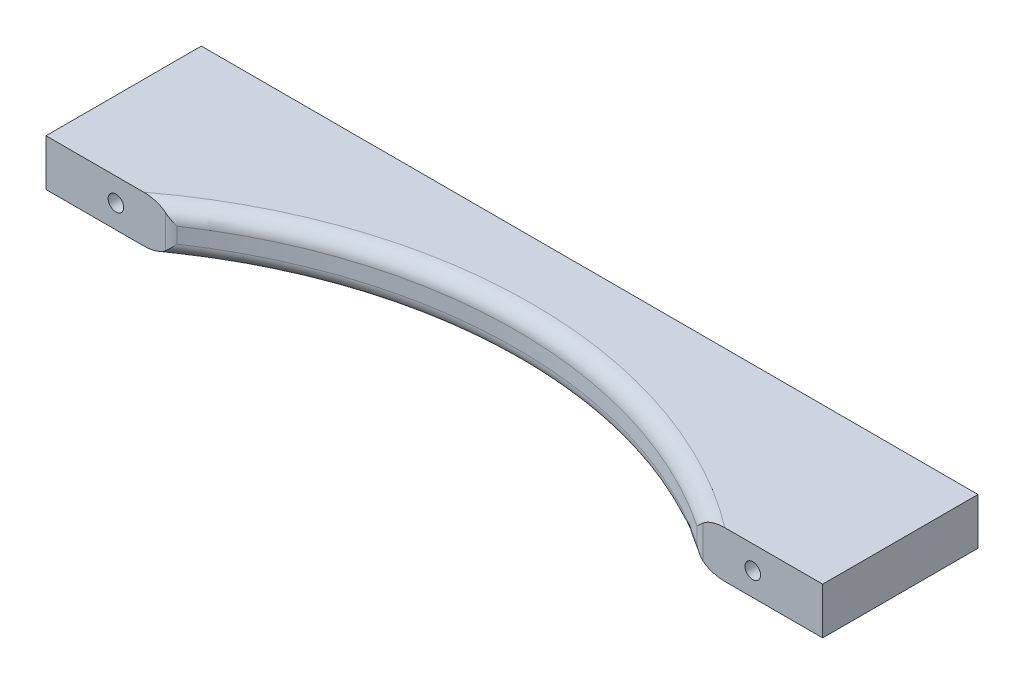
ISO-10303-21;
HEADER;
FILE_DESCRIPTION(('STEP AP214'),'2;1');
FILE_NAME('part.step','',(''),(''),'','','');
FILE_SCHEMA(('AUTOMOTIVE_DESIGN { 1 0 10303 214 1 1 1 1 }'));
ENDSEC;
DATA;
#1=APPLICATION_CONTEXT('core data for automotive mechanical design processes');
#2=APPLICATION_PROTOCOL_DEFINITION('international standard','automotive_design',2000,#1);
#3=PRODUCT_CONTEXT('',#1,'mechanical');
#4=PRODUCT('Part','Part','',(#3));
#5=PRODUCT_RELATED_PRODUCT_CATEGORY('part','',(#4));
#6=PRODUCT_DEFINITION_FORMATION('','',#4);
#7=PRODUCT_DEFINITION_CONTEXT('part definition',#1,'design');
#8=PRODUCT_DEFINITION('design','',#6,#7);
#9=PRODUCT_DEFINITION_SHAPE('','',#8);
#10=(LENGTH_UNIT() NAMED_UNIT(*) SI_UNIT(.MILLI.,.METRE.));
#11=(NAMED_UNIT(*) PLANE_ANGLE_UNIT() SI_UNIT($,.RADIAN.));
#12=(NAMED_UNIT(*) SI_UNIT($,.STERADIAN.) SOLID_ANGLE_UNIT());
#13=UNCERTAINTY_MEASURE_WITH_UNIT(LENGTH_MEASURE(1.E-05),#10,'distance_accuracy_value','');
#14=(GEOMETRIC_REPRESENTATION_CONTEXT(3) GLOBAL_UNCERTAINTY_ASSIGNED_CONTEXT((#13)) GLOBAL_UNIT_ASSIGNED_CONTEXT((#10,
#11,#12)) REPRESENTATION_CONTEXT('',''));
#15=CARTESIAN_POINT('',(0.,0.,0.));
#16=DIRECTION('',(0.,0.,1.));
#17=DIRECTION('',(1.,0.,0.));
#18=AXIS2_PLACEMENT_3D('',#15,#16,#17);
#19=CARTESIAN_POINT('',(0.,0.,50.));
#20=DIRECTION('',(0.,0.,1.));
#21=DIRECTION('',(1.,0.,0.));
#22=AXIS2_PLACEMENT_3D('',#19,#20,#21);
#23=PLANE('',#22);
#24=DIRECTION('',(0.,1.,0.));
#25=VECTOR('',#24,1.);
#26=CARTESIAN_POINT('',(-109.039466664462,-31.249999999999,50.));
#27=LINE('',#26,#25);
#28=CARTESIAN_POINT('',(-109.039466664462,-44.0795960073652,50.));
#29=VERTEX_POINT('',#28);
#30=CARTESIAN_POINT('',(-109.039466664462,-33.4204039926329,50.));
#31=VERTEX_POINT('',#30);
#32=EDGE_CURVE('E61',#29,#31,#27,.T.);
#33=ORIENTED_EDGE('',*,*,#32,.T.);
#34=CARTESIAN_POINT('',(-109.039466664462,-33.4204039926329,50.));
#35=CARTESIAN_POINT('',(-109.121224439638,-33.3520970625122,50.));
#36=CARTESIAN_POINT('',(-109.204705555054,-33.2859015450738,50.));
#37=CARTESIAN_POINT('',(-109.374678941473,-33.1575612629484,50.));
#38=CARTESIAN_POINT('',(-109.461170041312,-33.0954149491876,50.));
#39=CARTESIAN_POINT('',(-109.724217485949,-32.9149794506193,50.));
#40=CARTESIAN_POINT('',(-109.904709502907,-32.8023963965578,50.));
#41=CARTESIAN_POINT('',(-110.272758878631,-32.5917061509023,50.));
#42=CARTESIAN_POINT('',(-110.460280000726,-32.4935348806494,50.));
#43=CARTESIAN_POINT('',(-110.841563246896,-32.3098756932209,50.));
#44=CARTESIAN_POINT('',(-111.035329891093,-32.2243972250962,50.));
#45=CARTESIAN_POINT('',(-111.546071512932,-32.0172719708917,50.));
#46=CARTESIAN_POINT('',(-111.866837557253,-31.9049256579682,50.));
#47=CARTESIAN_POINT('',(-112.516777365589,-31.7079959104703,50.));
#48=CARTESIAN_POINT('',(-112.845954432423,-31.6234235684507,50.));
#49=CARTESIAN_POINT('',(-113.510760899458,-31.4801933058538,50.));
#50=CARTESIAN_POINT('',(-113.846404951294,-31.4216038957608,50.));
#51=CARTESIAN_POINT('',(-114.520965682404,-31.3297585733566,50.));
#52=CARTESIAN_POINT('',(-114.859880429907,-31.2964885353288,50.));
#53=CARTESIAN_POINT('',(-115.339873066364,-31.2671570009662,50.));
#54=CARTESIAN_POINT('',(-115.480379741739,-31.2607171968633,50.));
#55=CARTESIAN_POINT('',(-115.761064979609,-31.2521469067584,50.));
#56=CARTESIAN_POINT('',(-115.901243114649,-31.2500024128778,50.));
#57=CARTESIAN_POINT('',(-116.041434669351,-31.2499999999991,50.));
#58=B_SPLINE_CURVE_WITH_KNOTS('',3,(#34,#35,#36,#37,#38,#39,#40,#41,#42,#43,#44,#45,#46,#47,#48,
#49,#50,#51,#52,#53,#54,#55,#56,#57),.UNSPECIFIED.,.F.,.F.,(4,2,2,2,2,2,2,2,2,2,2,4),(0.,
0.319525794409338,0.638928623632587,1.27633525859326,1.9108158954685,2.54576652335564,
3.56386955724189,4.58237871484075,5.60355768650752,6.62416652235498,7.04607651220801,
7.46660831291451),.UNSPECIFIED.);
#59=CARTESIAN_POINT('',(-116.041434669351,-31.2499999999989,50.));
#60=VERTEX_POINT('',#59);
#61=EDGE_CURVE('E241',#31,#60,#58,.T.);
#62=ORIENTED_EDGE('',*,*,#61,.T.);
#63=DIRECTION('',(-1.,0.,0.));
#64=VECTOR('',#63,1.);
#65=CARTESIAN_POINT('',(102.499999999998,-31.2499999999989,50.));
#66=LINE('',#65,#64);
#67=CARTESIAN_POINT('',(-147.500000000002,-31.2499999999991,50.));
#68=VERTEX_POINT('',#67);
#69=EDGE_CURVE('E149',#60,#68,#66,.T.);
#70=ORIENTED_EDGE('',*,*,#69,.T.);
#71=DIRECTION('',(0.,-1.,0.));
#72=VECTOR('',#71,1.);
#73=CARTESIAN_POINT('',(-147.500000000002,-31.2499999999991,50.));
#74=LINE('',#73,#72);
#75=CARTESIAN_POINT('',(-147.500000000002,-46.249999999999,50.));
#76=VERTEX_POINT('',#75);
#77=EDGE_CURVE('E155',#68,#76,#74,.T.);
#78=ORIENTED_EDGE('',*,*,#77,.T.);
#79=DIRECTION('',(1.,0.,0.));
#80=VECTOR('',#79,1.);
#81=CARTESIAN_POINT('',(-147.500000000002,-46.249999999999,50.));
#82=LINE('',#81,#80);
#83=CARTESIAN_POINT('',(-116.041434669351,-46.249999999999,50.));
#84=VERTEX_POINT('',#83);
#85=EDGE_CURVE('E133',#76,#84,#82,.T.);
#86=ORIENTED_EDGE('',*,*,#85,.T.);
#87=CARTESIAN_POINT('',(-116.041434669351,-46.249999999999,50.));
#88=CARTESIAN_POINT('',(-115.845856817225,-46.2499883262298,50.));
#89=CARTESIAN_POINT('',(-115.65028255459,-46.2458202956799,50.));
#90=CARTESIAN_POINT('',(-115.259472905755,-46.2291877109257,50.));
#91=CARTESIAN_POINT('',(-115.064237545169,-46.2167225548578,50.));
#92=CARTESIAN_POINT('',(-114.674126708154,-46.183483016634,50.));
#93=CARTESIAN_POINT('',(-114.479252449367,-46.1626942113724,50.));
#94=CARTESIAN_POINT('',(-114.090606718168,-46.1127412996749,50.));
#95=CARTESIAN_POINT('',(-113.896835215725,-46.083577422431,50.));
#96=CARTESIAN_POINT('',(-113.331073038017,-45.9856478479633,50.));
#97=CARTESIAN_POINT('',(-112.960967835018,-45.9052792159937,50.));
#98=CARTESIAN_POINT('',(-112.412697516045,-45.7596649519503,50.));
#99=CARTESIAN_POINT('',(-112.231111870841,-45.7069584779846,50.));
#100=CARTESIAN_POINT('',(-111.87070842836,-45.5928106454665,50.));
#101=CARTESIAN_POINT('',(-111.691890286954,-45.5313703827623,50.));
#102=CARTESIAN_POINT('',(-111.294647988112,-45.3832747748802,50.));
#103=CARTESIAN_POINT('',(-111.077149075772,-45.2941192171049,50.));
#104=CARTESIAN_POINT('',(-110.649176467055,-45.100597607759,50.));
#105=CARTESIAN_POINT('',(-110.438696678489,-44.9962451919993,50.));
#106=CARTESIAN_POINT('',(-110.127577316082,-44.8260078182845,50.));
#107=CARTESIAN_POINT('',(-110.02355366556,-44.7662635715145,50.));
#108=CARTESIAN_POINT('',(-109.818277077839,-44.6422044151797,50.));
#109=CARTESIAN_POINT('',(-109.717023737757,-44.577890175169,50.));
#110=CARTESIAN_POINT('',(-109.517466435023,-44.4442732926468,50.));
#111=CARTESIAN_POINT('',(-109.419170885288,-44.3749580346936,50.));
#112=CARTESIAN_POINT('',(-109.226338609784,-44.2311901352725,50.));
#113=CARTESIAN_POINT('',(-109.131803853346,-44.1567348566397,50.));
#114=CARTESIAN_POINT('',(-109.039466664462,-44.0795960073652,50.));
#115=B_SPLINE_CURVE_WITH_KNOTS('',3,(#87,#88,#89,#90,#91,#92,#93,#94,#95,#96,#97,#98,#99,#100,
#101,#102,#103,#104,#105,#106,#107,#108,#109,#110,#111,#112,#113,#114),.UNSPECIFIED.,.F.,.F.,(4,
2,2,2,2,2,2,2,2,2,2,2,2,4),(0.,0.586682938754656,1.17340843943332,1.76115504065223,
2.34888555914224,3.48332263064908,4.05039339803695,4.61739307647509,5.3220594043687,
6.02609730228276,6.38587789583573,6.74560588585582,7.10627538151129,7.46713131942787),.UNSPECIFIED.);
#116=EDGE_CURVE('E66',#84,#29,#115,.T.);
#117=ORIENTED_EDGE('',*,*,#116,.T.);
#118=EDGE_LOOP('',(#33,#62,#70,#78,#86,#117));
#119=FACE_BOUND('',#118,.T.);
#120=CARTESIAN_POINT('',(-125.000000000002,-38.7499999999989,50.));
#121=DIRECTION('',(0.,0.,1.));
#122=DIRECTION('',(1.,0.,0.));
#123=AXIS2_PLACEMENT_3D('',#120,#121,#122);
#124=CIRCLE('',#123,2.50000000001049);
#125=CARTESIAN_POINT('',(-122.499999999992,-38.7499999999989,50.));
#126=VERTEX_POINT('',#125);
#127=EDGE_CURVE('E160',#126,#126,#124,.T.);
#128=ORIENTED_EDGE('',*,*,#127,.F.);
#129=EDGE_LOOP('',(#128));
#130=FACE_BOUND('',#129,.T.);
#131=ADVANCED_FACE('F39',(#119,#130),#23,.T.);
#132=CARTESIAN_POINT('',(102.499999999998,-31.2499999999989,50.));
#133=VERTEX_POINT('',#132);
#134=CARTESIAN_POINT('',(71.0414346693464,-31.2499999999989,50.));
#135=VERTEX_POINT('',#134);
#136=EDGE_CURVE('E151',#133,#135,#66,.T.);
#137=ORIENTED_EDGE('',*,*,#136,.T.);
#138=CARTESIAN_POINT('',(71.0414346693464,-31.2499999999989,50.));
#139=CARTESIAN_POINT('',(70.8458568172207,-31.2500116737681,50.));
#140=CARTESIAN_POINT('',(70.6502825545853,-31.2541797043181,50.));
#141=CARTESIAN_POINT('',(70.2594729057507,-31.2708122890722,50.));
#142=CARTESIAN_POINT('',(70.0642375451653,-31.2832774451401,50.));
#143=CARTESIAN_POINT('',(69.6741267081493,-31.3165169833639,50.));
#144=CARTESIAN_POINT('',(69.4792524493629,-31.3373057886255,50.));
#145=CARTESIAN_POINT('',(69.0906067181636,-31.3872587003231,50.));
#146=CARTESIAN_POINT('',(68.8968352157208,-31.4164225775669,50.));
#147=CARTESIAN_POINT('',(68.3310730380126,-31.5143521520347,50.));
#148=CARTESIAN_POINT('',(67.9609678350139,-31.5947207840042,50.));
#149=CARTESIAN_POINT('',(67.412697516041,-31.7403350480476,50.));
#150=CARTESIAN_POINT('',(67.2311118708366,-31.7930415220133,50.));
#151=CARTESIAN_POINT('',(66.8707084283555,-31.9071893545314,50.));
#152=CARTESIAN_POINT('',(66.6918902869503,-31.9686296172356,50.));
#153=CARTESIAN_POINT('',(66.2946479881079,-32.1167252251177,50.));
#154=CARTESIAN_POINT('',(66.0771490757676,-32.205880782893,50.));
#155=CARTESIAN_POINT('',(65.6491764670506,-32.3994023922389,50.));
#156=CARTESIAN_POINT('',(65.4386966784844,-32.5037548079986,50.));
#157=CARTESIAN_POINT('',(65.1275773160779,-32.6739921817134,50.));
#158=CARTESIAN_POINT('',(65.0235536655558,-32.7337364284834,50.));
#159=CARTESIAN_POINT('',(64.8182770778344,-32.8577955848182,50.));
#160=CARTESIAN_POINT('',(64.7170237377526,-32.922109824829,50.));
#161=CARTESIAN_POINT('',(64.5174664350191,-33.0557267073512,50.));
#162=CARTESIAN_POINT('',(64.4191708852835,-33.1250419653043,50.));
#163=CARTESIAN_POINT('',(64.22633860978,-33.2688098647255,50.));
#164=CARTESIAN_POINT('',(64.1318038533419,-33.3432651433582,50.));
#165=CARTESIAN_POINT('',(64.0394666644578,-33.4204039926327,50.));
#166=B_SPLINE_CURVE_WITH_KNOTS('',3,(#138,#139,#140,#141,#142,#143,#144,#145,#146,#147,#148,
#149,#150,#151,#152,#153,#154,#155,#156,#157,#158,#159,#160,#161,#162,#163,#164,#165),
.UNSPECIFIED.,.F.,.F.,(4,2,2,2,2,2,2,2,2,2,2,2,2,4),(0.,0.586682938754628,1.17340843943328,
1.76115504065217,2.34888555914217,3.48332263064899,4.05039339803683,4.61739307647493,
5.32205940436859,6.02609730228269,6.38587789583572,6.74560588585582,7.10627538151132,
7.46713131942789),.UNSPECIFIED.);
#167=CARTESIAN_POINT('',(64.0394666644578,-33.4204039926327,50.));
#168=VERTEX_POINT('',#167);
#169=EDGE_CURVE('E222',#135,#168,#166,.T.);
#170=ORIENTED_EDGE('',*,*,#169,.T.);
#171=DIRECTION('',(0.,1.,0.));
#172=VECTOR('',#171,1.);
#173=CARTESIAN_POINT('',(64.0394666644578,-46.249999999999,50.));
#174=LINE('',#173,#172);
#175=CARTESIAN_POINT('',(64.0394666644578,-44.0795960073652,50.));
#176=VERTEX_POINT('',#175);
#177=EDGE_CURVE('E178',#168,#176,#174,.F.);
#178=ORIENTED_EDGE('',*,*,#177,.T.);
#179=CARTESIAN_POINT('',(64.0394666644578,-44.0795960073652,50.));
#180=CARTESIAN_POINT('',(64.1212244396342,-44.1479029374859,50.));
#181=CARTESIAN_POINT('',(64.2047055550495,-44.2140984549243,50.));
#182=CARTESIAN_POINT('',(64.3746789414692,-44.3424387370497,50.));
#183=CARTESIAN_POINT('',(64.4611700413075,-44.4045850508105,50.));
#184=CARTESIAN_POINT('',(64.7242174859446,-44.5850205493788,50.));
#185=CARTESIAN_POINT('',(64.9047095029032,-44.6976036034403,50.));
#186=CARTESIAN_POINT('',(65.2727588786271,-44.9082938490958,50.));
#187=CARTESIAN_POINT('',(65.4602800007222,-45.0064651193487,50.));
#188=CARTESIAN_POINT('',(65.8415632468915,-45.1901243067772,50.));
#189=CARTESIAN_POINT('',(66.0353298910883,-45.2756027749019,50.));
#190=CARTESIAN_POINT('',(66.5460715129274,-45.4827280291064,50.));
#191=CARTESIAN_POINT('',(66.8668375572483,-45.5950743420299,50.));
#192=CARTESIAN_POINT('',(67.5167773655852,-45.7920040895278,50.));
#193=CARTESIAN_POINT('',(67.8459544324192,-45.8765764315474,50.));
#194=CARTESIAN_POINT('',(68.5107608994533,-46.0198066941443,50.));
#195=CARTESIAN_POINT('',(68.8464049512902,-46.0783961042373,50.));
#196=CARTESIAN_POINT('',(69.5209656823996,-46.1702414266415,50.));
#197=CARTESIAN_POINT('',(69.8598804299028,-46.2035114646693,50.));
#198=CARTESIAN_POINT('',(70.3398730663599,-46.2328429990319,50.));
#199=CARTESIAN_POINT('',(70.4803797417343,-46.2392828031348,50.));
#200=CARTESIAN_POINT('',(70.7610649796051,-46.2478530932397,50.));
#201=CARTESIAN_POINT('',(70.9012431146447,-46.2499975871203,50.));
#202=CARTESIAN_POINT('',(71.0414346693464,-46.249999999999,50.));
#203=B_SPLINE_CURVE_WITH_KNOTS('',3,(#179,#180,#181,#182,#183,#184,#185,#186,#187,#188,#189,
#190,#191,#192,#193,#194,#195,#196,#197,#198,#199,#200,#201,#202),.UNSPECIFIED.,.F.,.F.,(4,2,2,
2,2,2,2,2,2,2,2,4),(0.,0.319525794409333,0.638928623632583,1.27633525859326,1.91081589546849,
2.54576652335564,3.5638695572419,4.58237871484077,5.60355768650754,6.62416652235501,
7.04607651220803,7.46660831291452),.UNSPECIFIED.);
#204=CARTESIAN_POINT('',(71.0414346693464,-46.249999999999,50.));
#205=VERTEX_POINT('',#204);
#206=EDGE_CURVE('E130',#176,#205,#203,.T.);
#207=ORIENTED_EDGE('',*,*,#206,.T.);
#208=CARTESIAN_POINT('',(102.499999999998,-46.249999999999,50.));
#209=VERTEX_POINT('',#208);
#210=EDGE_CURVE('E120',#205,#209,#82,.T.);
#211=ORIENTED_EDGE('',*,*,#210,.T.);
#212=DIRECTION('',(0.,1.,0.));
#213=VECTOR('',#212,1.);
#214=CARTESIAN_POINT('',(102.499999999998,-46.249999999999,50.));
#215=LINE('',#214,#213);
#216=EDGE_CURVE('E126',#209,#133,#215,.T.);
#217=ORIENTED_EDGE('',*,*,#216,.T.);
#218=EDGE_LOOP('',(#137,#170,#178,#207,#211,#217));
#219=FACE_BOUND('',#218,.T.);
#220=CARTESIAN_POINT('',(79.9999999999979,-38.7499999999989,50.));
#221=DIRECTION('',(0.,0.,1.));
#222=DIRECTION('',(1.,0.,0.));
#223=AXIS2_PLACEMENT_3D('',#220,#221,#222);
#224=CIRCLE('',#223,2.50000000001049);
#225=CARTESIAN_POINT('',(82.5000000000083,-38.7499999999989,50.));
#226=VERTEX_POINT('',#225);
#227=EDGE_CURVE('E281',#226,#226,#224,.T.);
#228=ORIENTED_EDGE('',*,*,#227,.F.);
#229=EDGE_LOOP('',(#228));
#230=FACE_BOUND('',#229,.T.);
#231=ADVANCED_FACE('F123',(#219,#230),#23,.T.);
#232=CARTESIAN_POINT('',(0.,0.,0.));
#233=DIRECTION('',(0.,0.,1.));
#234=DIRECTION('',(1.,0.,0.));
#235=AXIS2_PLACEMENT_3D('',#232,#233,#234);
#236=PLANE('',#235);
#237=DIRECTION('',(1.,0.,0.));
#238=VECTOR('',#237,1.);
#239=CARTESIAN_POINT('',(79.9999999999979,-46.249999999999,0.));
#240=LINE('',#239,#238);
#241=CARTESIAN_POINT('',(-147.500000000002,-46.249999999999,0.));
#242=VERTEX_POINT('',#241);
#243=CARTESIAN_POINT('',(102.499999999998,-46.249999999999,0.));
#244=VERTEX_POINT('',#243);
#245=EDGE_CURVE('E140',#242,#244,#240,.T.);
#246=ORIENTED_EDGE('',*,*,#245,.F.);
#247=DIRECTION('',(0.,-1.,0.));
#248=VECTOR('',#247,1.);
#249=CARTESIAN_POINT('',(-147.500000000002,-31.2499999999991,0.));
#250=LINE('',#249,#248);
#251=CARTESIAN_POINT('',(-147.500000000002,-31.2499999999991,0.));
#252=VERTEX_POINT('',#251);
#253=EDGE_CURVE('E134',#252,#242,#250,.T.);
#254=ORIENTED_EDGE('',*,*,#253,.F.);
#255=DIRECTION('',(-1.,0.,0.));
#256=VECTOR('',#255,1.);
#257=CARTESIAN_POINT('',(79.9999999999979,-31.2499999999989,0.));
#258=LINE('',#257,#256);
#259=CARTESIAN_POINT('',(102.499999999998,-31.2499999999989,0.));
#260=VERTEX_POINT('',#259);
#261=EDGE_CURVE('E162',#260,#252,#258,.T.);
#262=ORIENTED_EDGE('',*,*,#261,.F.);
#263=DIRECTION('',(0.,1.,0.));
#264=VECTOR('',#263,1.);
#265=CARTESIAN_POINT('',(102.499999999998,-46.249999999999,0.));
#266=LINE('',#265,#264);
#267=EDGE_CURVE('E159',#244,#260,#266,.T.);
#268=ORIENTED_EDGE('',*,*,#267,.F.);
#269=EDGE_LOOP('',(#246,#254,#262,#268));
#270=FACE_BOUND('',#269,.T.);
#271=CARTESIAN_POINT('',(-125.000000000002,-38.7499999999989,0.));
#272=DIRECTION('',(0.,0.,1.));
#273=DIRECTION('',(1.,0.,0.));
#274=AXIS2_PLACEMENT_3D('',#271,#272,#273);
#275=CIRCLE('',#274,2.50000000001049);
#276=CARTESIAN_POINT('',(-122.499999999992,-38.7499999999989,0.));
#277=VERTEX_POINT('',#276);
#278=EDGE_CURVE('E276',#277,#277,#275,.T.);
#279=ORIENTED_EDGE('',*,*,#278,.T.);
#280=EDGE_LOOP('',(#279));
#281=FACE_BOUND('',#280,.T.);
#282=CARTESIAN_POINT('',(79.9999999999979,-38.7499999999989,0.));
#283=DIRECTION('',(0.,0.,1.));
#284=DIRECTION('',(1.,0.,0.));
#285=AXIS2_PLACEMENT_3D('',#282,#283,#284);
#286=CIRCLE('',#285,2.50000000001049);
#287=CARTESIAN_POINT('',(82.5000000000083,-38.7499999999989,0.));
#288=VERTEX_POINT('',#287);
#289=EDGE_CURVE('E279',#288,#288,#286,.T.);
#290=ORIENTED_EDGE('',*,*,#289,.T.);
#291=EDGE_LOOP('',(#290));
#292=FACE_BOUND('',#291,.T.);
#293=ADVANCED_FACE('F270',(#270,#281,#292),#236,.F.);
#294=CARTESIAN_POINT('',(79.9999999999979,-46.249999999999,50.));
#295=DIRECTION('',(0.,1.,0.));
#296=DIRECTION('',(0.,0.,1.));
#297=AXIS2_PLACEMENT_3D('',#294,#295,#296);
#298=PLANE('',#297);
#299=ORIENTED_EDGE('',*,*,#210,.F.);
#300=CARTESIAN_POINT('',(-22.5000000000021,-46.249999999999,173.592070943083));
#301=DIRECTION('',(0.,1.,0.));
#302=DIRECTION('',(0.,0.,1.));
#303=AXIS2_PLACEMENT_3D('',#300,#301,#302);
#304=CIRCLE('',#303,155.);
#305=EDGE_CURVE('E11',#205,#84,#304,.T.);
#306=ORIENTED_EDGE('',*,*,#305,.T.);
#307=ORIENTED_EDGE('',*,*,#85,.F.);
#308=DIRECTION('',(0.,0.,-1.));
#309=VECTOR('',#308,1.);
#310=CARTESIAN_POINT('',(-147.500000000002,-46.249999999999,50.));
#311=LINE('',#310,#309);
#312=EDGE_CURVE('E157',#76,#242,#311,.T.);
#313=ORIENTED_EDGE('',*,*,#312,.T.);
#314=ORIENTED_EDGE('',*,*,#245,.T.);
#315=DIRECTION('',(0.,0.,-1.));
#316=VECTOR('',#315,1.);
#317=CARTESIAN_POINT('',(102.499999999998,-46.249999999999,50.));
#318=LINE('',#317,#316);
#319=EDGE_CURVE('E137',#209,#244,#318,.T.);
#320=ORIENTED_EDGE('',*,*,#319,.F.);
#321=EDGE_LOOP('',(#299,#306,#307,#313,#314,#320));
#322=FACE_BOUND('',#321,.T.);
#323=ADVANCED_FACE('F138',(#322),#298,.F.);
#324=CARTESIAN_POINT('',(102.499999999998,-46.249999999999,50.));
#325=DIRECTION('',(-1.,0.,0.));
#326=DIRECTION('',(0.,0.,1.));
#327=AXIS2_PLACEMENT_3D('',#324,#325,#326);
#328=PLANE('',#327);
#329=ORIENTED_EDGE('',*,*,#267,.T.);
#330=DIRECTION('',(0.,0.,-1.));
#331=VECTOR('',#330,1.);
#332=CARTESIAN_POINT('',(102.499999999998,-31.2499999999989,50.));
#333=LINE('',#332,#331);
#334=EDGE_CURVE('E144',#133,#260,#333,.T.);
#335=ORIENTED_EDGE('',*,*,#334,.F.);
#336=ORIENTED_EDGE('',*,*,#216,.F.);
#337=ORIENTED_EDGE('',*,*,#319,.T.);
#338=EDGE_LOOP('',(#329,#335,#336,#337));
#339=FACE_BOUND('',#338,.T.);
#340=ADVANCED_FACE('F146',(#339),#328,.F.);
#341=CARTESIAN_POINT('',(79.9999999999979,-31.2499999999989,50.));
#342=DIRECTION('',(0.,-1.,0.));
#343=DIRECTION('',(1.,0.,0.));
#344=AXIS2_PLACEMENT_3D('',#341,#342,#343);
#345=PLANE('',#344);
#346=ORIENTED_EDGE('',*,*,#69,.F.);
#347=CARTESIAN_POINT('',(-22.5000000000021,-31.249999999999,173.592070943083));
#348=DIRECTION('',(0.,-1.,0.));
#349=DIRECTION('',(1.,0.,0.));
#350=AXIS2_PLACEMENT_3D('',#347,#348,#349);
#351=CIRCLE('',#350,155.);
#352=EDGE_CURVE('E53',#60,#135,#351,.T.);
#353=ORIENTED_EDGE('',*,*,#352,.T.);
#354=ORIENTED_EDGE('',*,*,#136,.F.);
#355=ORIENTED_EDGE('',*,*,#334,.T.);
#356=ORIENTED_EDGE('',*,*,#261,.T.);
#357=DIRECTION('',(0.,0.,-1.));
#358=VECTOR('',#357,1.);
#359=CARTESIAN_POINT('',(-147.500000000002,-31.2499999999991,50.));
#360=LINE('',#359,#358);
#361=EDGE_CURVE('E167',#68,#252,#360,.T.);
#362=ORIENTED_EDGE('',*,*,#361,.F.);
#363=EDGE_LOOP('',(#346,#353,#354,#355,#356,#362));
#364=FACE_BOUND('',#363,.T.);
#365=ADVANCED_FACE('F250',(#364),#345,.F.);
#366=CARTESIAN_POINT('',(-147.500000000002,-31.2499999999991,50.));
#367=DIRECTION('',(1.,0.,0.));
#368=DIRECTION('',(0.,0.,-1.));
#369=AXIS2_PLACEMENT_3D('',#366,#367,#368);
#370=PLANE('',#369);
#371=ORIENTED_EDGE('',*,*,#253,.T.);
#372=ORIENTED_EDGE('',*,*,#312,.F.);
#373=ORIENTED_EDGE('',*,*,#77,.F.);
#374=ORIENTED_EDGE('',*,*,#361,.T.);
#375=EDGE_LOOP('',(#371,#372,#373,#374));
#376=FACE_BOUND('',#375,.T.);
#377=ADVANCED_FACE('F267',(#376),#370,.F.);
#378=CARTESIAN_POINT('',(-125.000000000002,-38.7499999999989,50.));
#379=DIRECTION('',(0.,0.,-1.));
#380=DIRECTION('',(-1.,0.,0.));
#381=AXIS2_PLACEMENT_3D('',#378,#379,#380);
#382=CYLINDRICAL_SURFACE('',#381,2.50000000001049);
#383=ORIENTED_EDGE('',*,*,#127,.T.);
#384=EDGE_LOOP('',(#383));
#385=FACE_BOUND('',#384,.T.);
#386=ORIENTED_EDGE('',*,*,#278,.F.);
#387=EDGE_LOOP('',(#386));
#388=FACE_BOUND('',#387,.T.);
#389=ADVANCED_FACE('F289',(#385,#388),#382,.F.);
#390=CARTESIAN_POINT('',(79.9999999999979,-38.7499999999989,50.));
#391=DIRECTION('',(0.,0.,-1.));
#392=DIRECTION('',(-1.,0.,0.));
#393=AXIS2_PLACEMENT_3D('',#390,#391,#392);
#394=CYLINDRICAL_SURFACE('',#393,2.50000000001049);
#395=ORIENTED_EDGE('',*,*,#227,.T.);
#396=EDGE_LOOP('',(#395));
#397=FACE_BOUND('',#396,.T.);
#398=ORIENTED_EDGE('',*,*,#289,.F.);
#399=EDGE_LOOP('',(#398));
#400=FACE_BOUND('',#399,.T.);
#401=ADVANCED_FACE('F322',(#397,#400),#394,.F.);
#402=CARTESIAN_POINT('',(-22.5000000000021,140.788887223428,173.592070943083));
#403=DIRECTION('',(0.,-1.,0.));
#404=DIRECTION('',(0.,0.,-1.));
#405=AXIS2_PLACEMENT_3D('',#402,#403,#404);
#406=CYLINDRICAL_SURFACE('',#405,150.);
#407=DIRECTION('',(0.,-1.,0.));
#408=VECTOR('',#407,1.);
#409=CARTESIAN_POINT('',(61.2478709656043,140.788887223428,49.1481313207446));
#410=LINE('',#409,#408);
#411=CARTESIAN_POINT('',(61.2478709656043,-41.249999999999,49.1481313207446));
#412=VERTEX_POINT('',#411);
#413=CARTESIAN_POINT('',(61.2478709656043,-36.2499999999989,49.1481313207446));
#414=VERTEX_POINT('',#413);
#415=EDGE_CURVE('E232',#412,#414,#410,.F.);
#416=ORIENTED_EDGE('',*,*,#415,.T.);
#417=CARTESIAN_POINT('',(-22.5000000000021,-36.249999999999,173.592070943083));
#418=DIRECTION('',(0.,-1.,0.));
#419=DIRECTION('',(1.,0.,0.));
#420=AXIS2_PLACEMENT_3D('',#417,#418,#419);
#421=CIRCLE('',#420,150.);
#422=CARTESIAN_POINT('',(-106.247870965609,-36.2499999999991,49.1481313207446));
#423=VERTEX_POINT('',#422);
#424=EDGE_CURVE('E235',#414,#423,#421,.F.);
#425=ORIENTED_EDGE('',*,*,#424,.T.);
#426=DIRECTION('',(0.,-1.,0.));
#427=VECTOR('',#426,1.);
#428=CARTESIAN_POINT('',(-106.247870965609,140.788887223428,49.1481313207446));
#429=LINE('',#428,#427);
#430=CARTESIAN_POINT('',(-106.247870965609,-41.249999999999,49.1481313207446));
#431=VERTEX_POINT('',#430);
#432=EDGE_CURVE('E230',#423,#431,#429,.T.);
#433=ORIENTED_EDGE('',*,*,#432,.T.);
#434=CARTESIAN_POINT('',(-22.5000000000021,-41.249999999999,173.592070943083));
#435=DIRECTION('',(0.,1.,0.));
#436=DIRECTION('',(0.,0.,1.));
#437=AXIS2_PLACEMENT_3D('',#434,#435,#436);
#438=CIRCLE('',#437,150.);
#439=EDGE_CURVE('E228',#431,#412,#438,.F.);
#440=ORIENTED_EDGE('',*,*,#439,.T.);
#441=EDGE_LOOP('',(#416,#425,#433,#440));
#442=FACE_BOUND('',#441,.T.);
#443=ADVANCED_FACE('F318',(#442),#406,.F.);
#444=CARTESIAN_POINT('',(-109.039466664462,140.788887223428,45.));
#445=DIRECTION('',(0.,-1.,0.));
#446=DIRECTION('',(0.,0.,-1.));
#447=AXIS2_PLACEMENT_3D('',#444,#445,#446);
#448=CYLINDRICAL_SURFACE('',#447,5.);
#449=CARTESIAN_POINT('',(-109.039466664462,-44.0795960073652,50.));
#450=CARTESIAN_POINT('',(-108.876951240094,-43.9437752789566,49.9999623090214));
#451=CARTESIAN_POINT('',(-108.716787075166,-43.805292021866,49.9920781076421));
#452=CARTESIAN_POINT('',(-108.401727146192,-43.5241463396725,49.9616947979704));
#453=CARTESIAN_POINT('',(-108.246828678767,-43.3814861312147,49.9392033119633));
#454=CARTESIAN_POINT('',(-107.943069874057,-43.0933436456044,49.8807533008525));
#455=CARTESIAN_POINT('',(-107.794195612027,-42.9478691796273,49.8448280622102));
#456=CARTESIAN_POINT('',(-107.50246575215,-42.6546062486792,49.7603248628885));
#457=CARTESIAN_POINT('',(-107.359610039625,-42.5068178278722,49.7117471434173));
#458=CARTESIAN_POINT('',(-107.049288785784,-42.1767099510079,49.5905082658972));
#459=CARTESIAN_POINT('',(-106.88339000629,-41.9939999176589,49.5148953639485));
#460=CARTESIAN_POINT('',(-106.561861025455,-41.6275323772403,49.3467629684968));
#461=CARTESIAN_POINT('',(-106.406223747355,-41.4437756890421,49.2542552958852));
#462=CARTESIAN_POINT('',(-106.253358098784,-41.256721066938,49.151820078794));
#463=CARTESIAN_POINT('',(-106.250613607441,-41.2533605209992,49.1499770519272));
#464=CARTESIAN_POINT('',(-106.247870965609,-41.249999999999,49.1481313207446));
#465=B_SPLINE_CURVE_WITH_KNOTS('',3,(#449,#450,#451,#452,#453,#454,#455,#456,#457,#458,#459,
#460,#461,#462,#463,#464),.UNSPECIFIED.,.F.,.F.,(4,2,2,2,2,2,2,4),(0.,0.635081323463752,
1.2698315185859,1.90301922611514,2.5361948633671,3.30976638727986,4.08279871984809,
4.09694085889239),.UNSPECIFIED.);
#466=EDGE_CURVE('E204',#431,#29,#465,.F.);
#467=ORIENTED_EDGE('',*,*,#466,.F.);
#468=ORIENTED_EDGE('',*,*,#432,.F.);
#469=CARTESIAN_POINT('',(-109.039466664462,-33.4204039926329,50.));
#470=CARTESIAN_POINT('',(-108.876951240094,-33.5562247210418,49.9999623090216));
#471=CARTESIAN_POINT('',(-108.716787075167,-33.6947079781321,49.9920781076422));
#472=CARTESIAN_POINT('',(-108.401727146192,-33.9758536603249,49.9616947979703));
#473=CARTESIAN_POINT('',(-108.246828678767,-34.1185138687823,49.9392033119631));
#474=CARTESIAN_POINT('',(-107.943069874058,-34.4066563543935,49.8807533008529));
#475=CARTESIAN_POINT('',(-107.794195612028,-34.5521308203719,49.8448280622112));
#476=CARTESIAN_POINT('',(-107.502465752149,-34.8453937513171,49.7603248628877));
#477=CARTESIAN_POINT('',(-107.35961003962,-34.9931821721199,49.711747143414));
#478=CARTESIAN_POINT('',(-107.04928878579,-35.3232900489973,49.5905082659013));
#479=CARTESIAN_POINT('',(-106.883390006314,-35.5060000823684,49.514895363965));
#480=CARTESIAN_POINT('',(-106.56186102543,-35.8724676227286,49.3467629684802));
#481=CARTESIAN_POINT('',(-106.406223747262,-36.0562243108463,49.2542552958232));
#482=CARTESIAN_POINT('',(-106.253358098781,-36.2432789330561,49.1518200787918));
#483=CARTESIAN_POINT('',(-106.250613607439,-36.2466394789969,49.149977051926));
#484=CARTESIAN_POINT('',(-106.247870965609,-36.2499999999991,49.1481313207446));
#485=B_SPLINE_CURVE_WITH_KNOTS('',3,(#469,#470,#471,#472,#473,#474,#475,#476,#477,#478,#479,
#480,#481,#482,#483,#484),.UNSPECIFIED.,.F.,.F.,(4,2,2,2,2,2,2,4),(0.,0.635081323463146,
1.26983151858481,1.90301922611463,2.53619486336711,3.30976638727992,4.08279871984809,
4.09694085889239),.UNSPECIFIED.);
#486=EDGE_CURVE('E44',#31,#423,#485,.T.);
#487=ORIENTED_EDGE('',*,*,#486,.F.);
#488=ORIENTED_EDGE('',*,*,#32,.F.);
#489=EDGE_LOOP('',(#467,#468,#487,#488));
#490=FACE_BOUND('',#489,.T.);
#491=ADVANCED_FACE('F41',(#490),#448,.T.);
#492=CARTESIAN_POINT('',(-22.5000000000021,-36.249999999999,173.592070943083));
#493=DIRECTION('',(0.,-1.,0.));
#494=DIRECTION('',(1.,0.,0.));
#495=AXIS2_PLACEMENT_3D('',#492,#493,#494);
#496=TOROIDAL_SURFACE('',#495,155.,5.);
#497=ORIENTED_EDGE('',*,*,#486,.T.);
#498=ORIENTED_EDGE('',*,*,#424,.F.);
#499=CARTESIAN_POINT('',(64.0394666644578,-33.4204039926327,50.));
#500=CARTESIAN_POINT('',(63.8769512400898,-33.5562247210414,49.9999623090214));
#501=CARTESIAN_POINT('',(63.7167870751623,-33.6947079781319,49.9920781076421));
#502=CARTESIAN_POINT('',(63.4017271461874,-33.9758536603254,49.9616947979704));
#503=CARTESIAN_POINT('',(63.2468286787623,-34.1185138687831,49.9392033119633));
#504=CARTESIAN_POINT('',(62.9430698740527,-34.4066563543935,49.8807533008525));
#505=CARTESIAN_POINT('',(62.7941956120225,-34.5521308203707,49.8448280622103));
#506=CARTESIAN_POINT('',(62.5024657521454,-34.8453937513186,49.7603248628884));
#507=CARTESIAN_POINT('',(62.3596100396205,-34.9931821721252,49.711747143417));
#508=CARTESIAN_POINT('',(62.04928878578,-35.3232900489907,49.5905082658976));
#509=CARTESIAN_POINT('',(61.8833900062877,-35.5060000823417,49.5148953639501));
#510=CARTESIAN_POINT('',(61.5618610254486,-35.8724676227551,49.3467629684953));
#511=CARTESIAN_POINT('',(61.4062237473425,-36.0562243109459,49.2542552958796));
#512=CARTESIAN_POINT('',(61.2533580987794,-36.2432789330595,49.1518200787938));
#513=CARTESIAN_POINT('',(61.2506136074364,-36.2466394789985,49.1499770519271));
#514=CARTESIAN_POINT('',(61.2478709656043,-36.2499999999989,49.1481313207446));
#515=B_SPLINE_CURVE_WITH_KNOTS('',3,(#499,#500,#501,#502,#503,#504,#505,#506,#507,#508,#509,
#510,#511,#512,#513,#514),.UNSPECIFIED.,.F.,.F.,(4,2,2,2,2,2,2,4),(0.,0.635081323463711,
1.26983151858585,1.90301922611513,2.53619486336712,3.30976638727987,4.08279871984809,
4.09694085889239),.UNSPECIFIED.);
#516=EDGE_CURVE('E210',#168,#414,#515,.T.);
#517=ORIENTED_EDGE('',*,*,#516,.F.);
#518=ORIENTED_EDGE('',*,*,#169,.F.);
#519=ORIENTED_EDGE('',*,*,#352,.F.);
#520=ORIENTED_EDGE('',*,*,#61,.F.);
#521=EDGE_LOOP('',(#497,#498,#517,#518,#519,#520));
#522=FACE_BOUND('',#521,.T.);
#523=ADVANCED_FACE('F189',(#522),#496,.T.);
#524=CARTESIAN_POINT('',(-22.5000000000021,-41.249999999999,173.592070943083));
#525=DIRECTION('',(0.,1.,0.));
#526=DIRECTION('',(0.,0.,1.));
#527=AXIS2_PLACEMENT_3D('',#524,#525,#526);
#528=TOROIDAL_SURFACE('',#527,155.,5.);
#529=ORIENTED_EDGE('',*,*,#305,.F.);
#530=ORIENTED_EDGE('',*,*,#206,.F.);
#531=CARTESIAN_POINT('',(64.0394666644578,-44.0795960073652,50.));
#532=CARTESIAN_POINT('',(63.8769512400895,-43.9437752789568,49.9999623090213));
#533=CARTESIAN_POINT('',(63.7167870751621,-43.805292021866,49.992078107642));
#534=CARTESIAN_POINT('',(63.4017271461873,-43.5241463396723,49.9616947979704));
#535=CARTESIAN_POINT('',(63.2468286787623,-43.3814861312143,49.9392033119634));
#536=CARTESIAN_POINT('',(62.9430698740524,-43.0933436456044,49.8807533008523));
#537=CARTESIAN_POINT('',(62.7941956120218,-42.9478691796278,49.8448280622099));
#538=CARTESIAN_POINT('',(62.5024657521459,-42.6546062486786,49.7603248628888));
#539=CARTESIAN_POINT('',(62.3596100396228,-42.5068178278701,49.7117471434185));
#540=CARTESIAN_POINT('',(62.0492887857772,-42.1767099510106,49.5905082658957));
#541=CARTESIAN_POINT('',(61.8833900062762,-41.9939999176699,49.5148953639423));
#542=CARTESIAN_POINT('',(61.56186102546,-41.6275323772293,49.346762968503));
#543=CARTESIAN_POINT('',(61.4062237473855,-41.443775689001,49.2542552959086));
#544=CARTESIAN_POINT('',(61.2533580987809,-41.2567210669365,49.1518200787949));
#545=CARTESIAN_POINT('',(61.2506136074372,-41.2533605209985,49.1499770519276));
#546=CARTESIAN_POINT('',(61.2478709656043,-41.249999999999,49.1481313207446));
#547=B_SPLINE_CURVE_WITH_KNOTS('',3,(#531,#532,#533,#534,#535,#536,#537,#538,#539,#540,#541,
#542,#543,#544,#545,#546),.UNSPECIFIED.,.F.,.F.,(4,2,2,2,2,2,2,4),(0.,0.635081323463904,
1.26983151858619,1.90301922611528,2.53619486336711,3.30976638727986,4.08279871984809,
4.09694085889239),.UNSPECIFIED.);
#548=EDGE_CURVE('E196',#412,#176,#547,.F.);
#549=ORIENTED_EDGE('',*,*,#548,.F.);
#550=ORIENTED_EDGE('',*,*,#439,.F.);
#551=ORIENTED_EDGE('',*,*,#466,.T.);
#552=ORIENTED_EDGE('',*,*,#116,.F.);
#553=EDGE_LOOP('',(#529,#530,#549,#550,#551,#552));
#554=FACE_BOUND('',#553,.T.);
#555=ADVANCED_FACE('F183',(#554),#528,.T.);
#556=CARTESIAN_POINT('',(64.0394666644578,140.788887223428,45.));
#557=DIRECTION('',(0.,-1.,0.));
#558=DIRECTION('',(0.,0.,-1.));
#559=AXIS2_PLACEMENT_3D('',#556,#557,#558);
#560=CYLINDRICAL_SURFACE('',#559,5.);
#561=ORIENTED_EDGE('',*,*,#516,.T.);
#562=ORIENTED_EDGE('',*,*,#415,.F.);
#563=ORIENTED_EDGE('',*,*,#548,.T.);
#564=ORIENTED_EDGE('',*,*,#177,.F.);
#565=EDGE_LOOP('',(#561,#562,#563,#564));
#566=FACE_BOUND('',#565,.T.);
#567=ADVANCED_FACE('F188',(#566),#560,.T.);
#568=CLOSED_SHELL('',(#131,#231,#293,#323,#340,#365,#377,#389,#401,#443,#491,#523,#555,#567));
#569=MANIFOLD_SOLID_BREP('B2',#568);
#570=ADVANCED_BREP_SHAPE_REPRESENTATION('',(#18,#569),#14);
#571=SHAPE_DEFINITION_REPRESENTATION(#9,#570);
ENDSEC;
END-ISO-10303-21;
